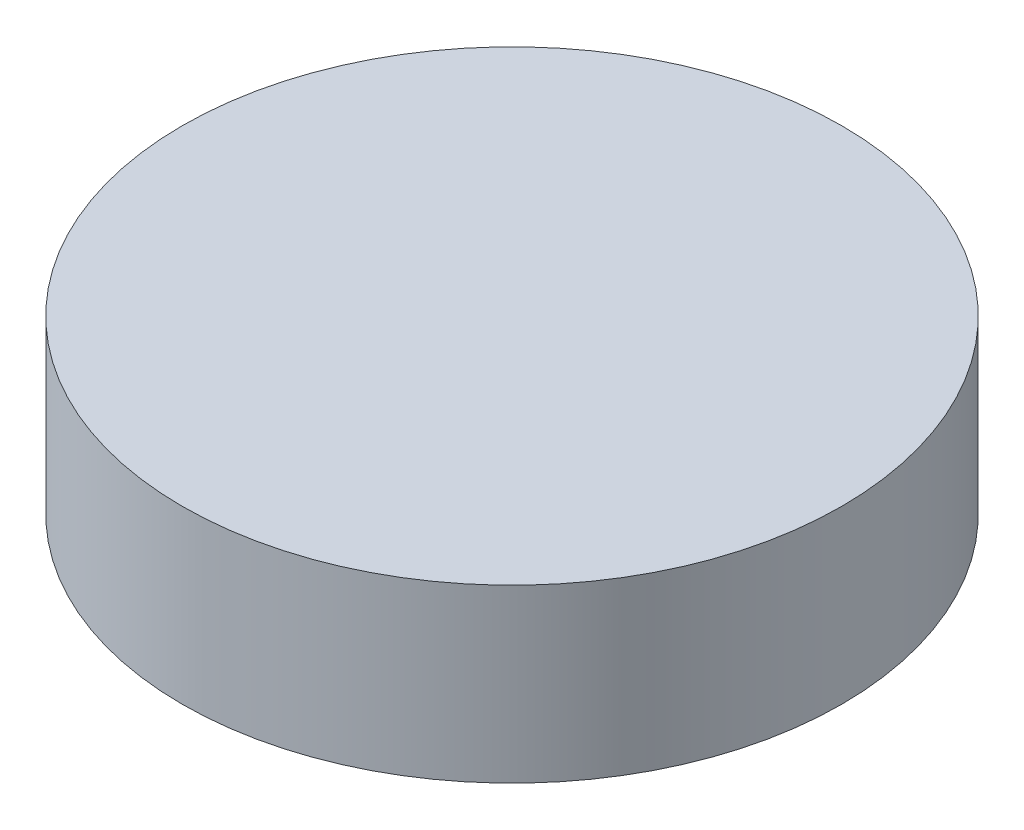
ISO-10303-21;
HEADER;
FILE_DESCRIPTION(('STEP AP214'),'2;1');
FILE_NAME('part.step','',(''),(''),'','','');
FILE_SCHEMA(('AUTOMOTIVE_DESIGN { 1 0 10303 214 1 1 1 1 }'));
ENDSEC;
DATA;
#1=APPLICATION_CONTEXT('core data for automotive mechanical design processes');
#2=APPLICATION_PROTOCOL_DEFINITION('international standard','automotive_design',2000,#1);
#3=PRODUCT_CONTEXT('',#1,'mechanical');
#4=PRODUCT('Part','Part','',(#3));
#5=PRODUCT_RELATED_PRODUCT_CATEGORY('part','',(#4));
#6=PRODUCT_DEFINITION_FORMATION('','',#4);
#7=PRODUCT_DEFINITION_CONTEXT('part definition',#1,'design');
#8=PRODUCT_DEFINITION('design','',#6,#7);
#9=PRODUCT_DEFINITION_SHAPE('','',#8);
#10=(LENGTH_UNIT() NAMED_UNIT(*) SI_UNIT(.MILLI.,.METRE.));
#11=(NAMED_UNIT(*) PLANE_ANGLE_UNIT() SI_UNIT($,.RADIAN.));
#12=(NAMED_UNIT(*) SI_UNIT($,.STERADIAN.) SOLID_ANGLE_UNIT());
#13=UNCERTAINTY_MEASURE_WITH_UNIT(LENGTH_MEASURE(1.E-05),#10,'distance_accuracy_value','');
#14=(GEOMETRIC_REPRESENTATION_CONTEXT(3) GLOBAL_UNCERTAINTY_ASSIGNED_CONTEXT((#13)) GLOBAL_UNIT_ASSIGNED_CONTEXT((#10,
#11,#12)) REPRESENTATION_CONTEXT('',''));
#15=CARTESIAN_POINT('',(0.,0.,0.));
#16=DIRECTION('',(0.,0.,1.));
#17=DIRECTION('',(1.,0.,0.));
#18=AXIS2_PLACEMENT_3D('',#15,#16,#17);
#19=CARTESIAN_POINT('',(0.,5.,0.));
#20=DIRECTION('',(0.,-1.,0.));
#21=DIRECTION('',(0.,0.,-1.));
#22=AXIS2_PLACEMENT_3D('',#19,#20,#21);
#23=CYLINDRICAL_SURFACE('',#22,7.5);
#24=CARTESIAN_POINT('',(0.,5.,0.));
#25=DIRECTION('',(0.,1.,0.));
#26=DIRECTION('',(0.,0.,1.));
#27=AXIS2_PLACEMENT_3D('',#24,#25,#26);
#28=CIRCLE('',#27,7.5);
#29=CARTESIAN_POINT('',(0.,5.,7.5));
#30=VERTEX_POINT('',#29);
#31=EDGE_CURVE('E10',#30,#30,#28,.T.);
#32=ORIENTED_EDGE('',*,*,#31,.F.);
#33=EDGE_LOOP('',(#32));
#34=FACE_BOUND('',#33,.T.);
#35=CARTESIAN_POINT('',(0.,0.,0.));
#36=DIRECTION('',(0.,1.,0.));
#37=DIRECTION('',(0.,0.,1.));
#38=AXIS2_PLACEMENT_3D('',#35,#36,#37);
#39=CIRCLE('',#38,7.5);
#40=CARTESIAN_POINT('',(0.,0.,7.5));
#41=VERTEX_POINT('',#40);
#42=EDGE_CURVE('E39',#41,#41,#39,.T.);
#43=ORIENTED_EDGE('',*,*,#42,.T.);
#44=EDGE_LOOP('',(#43));
#45=FACE_BOUND('',#44,.T.);
#46=ADVANCED_FACE('F36',(#34,#45),#23,.T.);
#47=CARTESIAN_POINT('',(0.,0.,0.));
#48=DIRECTION('',(0.,1.,0.));
#49=DIRECTION('',(0.,0.,1.));
#50=AXIS2_PLACEMENT_3D('',#47,#48,#49);
#51=PLANE('',#50);
#52=ORIENTED_EDGE('',*,*,#42,.F.);
#53=EDGE_LOOP('',(#52));
#54=FACE_BOUND('',#53,.T.);
#55=ADVANCED_FACE('F59',(#54),#51,.F.);
#56=CARTESIAN_POINT('',(0.,18.,0.));
#57=DIRECTION('',(0.,-1.,0.));
#58=DIRECTION('',(0.,0.,-1.));
#59=AXIS2_PLACEMENT_3D('',#56,#57,#58);
#60=CYLINDRICAL_SURFACE('',#59,25.);
#61=CARTESIAN_POINT('',(0.,18.,0.));
#62=DIRECTION('',(0.,1.,0.));
#63=DIRECTION('',(0.,0.,1.));
#64=AXIS2_PLACEMENT_3D('',#61,#62,#63);
#65=CIRCLE('',#64,25.);
#66=CARTESIAN_POINT('',(0.,18.,-25.));
#67=VERTEX_POINT('',#66);
#68=EDGE_CURVE('E46',#67,#67,#65,.T.);
#69=CARTESIAN_POINT('',(0.,5.,0.));
#70=DIRECTION('',(0.,1.,0.));
#71=DIRECTION('',(0.,0.,1.));
#72=AXIS2_PLACEMENT_3D('',#69,#70,#71);
#73=CIRCLE('',#72,25.);
#74=CARTESIAN_POINT('',(0.,5.,-25.));
#75=VERTEX_POINT('',#74);
#76=EDGE_CURVE('E48',#75,#75,#73,.T.);
#77=CARTESIAN_POINT('',(0.,18.,-25.));
#78=CARTESIAN_POINT('',(0.,17.8645833333333,-25.));
#79=CARTESIAN_POINT('',(0.,17.7291666666667,-25.));
#80=CARTESIAN_POINT('',(0.,17.4583333333333,-25.));
#81=CARTESIAN_POINT('',(0.,17.3229166666667,-25.));
#82=CARTESIAN_POINT('',(0.,17.0520833333333,-25.));
#83=CARTESIAN_POINT('',(0.,16.9166666666667,-25.));
#84=CARTESIAN_POINT('',(0.,16.6458333333333,-25.));
#85=CARTESIAN_POINT('',(0.,16.5104166666667,-25.));
#86=CARTESIAN_POINT('',(0.,16.2395833333333,-25.));
#87=CARTESIAN_POINT('',(0.,16.1041666666667,-25.));
#88=CARTESIAN_POINT('',(0.,15.8333333333333,-25.));
#89=CARTESIAN_POINT('',(0.,15.6979166666667,-25.));
#90=CARTESIAN_POINT('',(0.,15.4270833333333,-25.));
#91=CARTESIAN_POINT('',(0.,15.2916666666667,-25.));
#92=CARTESIAN_POINT('',(0.,15.0208333333333,-25.));
#93=CARTESIAN_POINT('',(0.,14.8854166666667,-25.));
#94=CARTESIAN_POINT('',(0.,14.6145833333333,-25.));
#95=CARTESIAN_POINT('',(0.,14.4791666666667,-25.));
#96=CARTESIAN_POINT('',(0.,14.2083333333333,-25.));
#97=CARTESIAN_POINT('',(0.,14.0729166666667,-25.));
#98=CARTESIAN_POINT('',(0.,13.8020833333333,-25.));
#99=CARTESIAN_POINT('',(0.,13.6666666666667,-25.));
#100=CARTESIAN_POINT('',(0.,13.3958333333333,-25.));
#101=CARTESIAN_POINT('',(0.,13.2604166666667,-25.));
#102=CARTESIAN_POINT('',(0.,12.9895833333333,-25.));
#103=CARTESIAN_POINT('',(0.,12.8541666666667,-25.));
#104=CARTESIAN_POINT('',(0.,12.5833333333333,-25.));
#105=CARTESIAN_POINT('',(0.,12.4479166666667,-25.));
#106=CARTESIAN_POINT('',(0.,12.1770833333333,-25.));
#107=CARTESIAN_POINT('',(0.,12.0416666666667,-25.));
#108=CARTESIAN_POINT('',(0.,11.7708333333333,-25.));
#109=CARTESIAN_POINT('',(0.,11.6354166666667,-25.));
#110=CARTESIAN_POINT('',(0.,11.3645833333333,-25.));
#111=CARTESIAN_POINT('',(0.,11.2291666666667,-25.));
#112=CARTESIAN_POINT('',(0.,10.9583333333333,-25.));
#113=CARTESIAN_POINT('',(0.,10.8229166666667,-25.));
#114=CARTESIAN_POINT('',(0.,10.5520833333333,-25.));
#115=CARTESIAN_POINT('',(0.,10.4166666666667,-25.));
#116=CARTESIAN_POINT('',(0.,10.1458333333333,-25.));
#117=CARTESIAN_POINT('',(0.,10.0104166666667,-25.));
#118=CARTESIAN_POINT('',(0.,9.73958333333333,-25.));
#119=CARTESIAN_POINT('',(0.,9.60416666666667,-25.));
#120=CARTESIAN_POINT('',(0.,9.33333333333333,-25.));
#121=CARTESIAN_POINT('',(0.,9.19791666666667,-25.));
#122=CARTESIAN_POINT('',(0.,8.92708333333333,-25.));
#123=CARTESIAN_POINT('',(0.,8.79166666666667,-25.));
#124=CARTESIAN_POINT('',(0.,8.52083333333333,-25.));
#125=CARTESIAN_POINT('',(0.,8.38541666666667,-25.));
#126=CARTESIAN_POINT('',(0.,8.11458333333333,-25.));
#127=CARTESIAN_POINT('',(0.,7.97916666666667,-25.));
#128=CARTESIAN_POINT('',(0.,7.70833333333333,-25.));
#129=CARTESIAN_POINT('',(0.,7.57291666666667,-25.));
#130=CARTESIAN_POINT('',(0.,7.30208333333333,-25.));
#131=CARTESIAN_POINT('',(0.,7.16666666666667,-25.));
#132=CARTESIAN_POINT('',(0.,6.89583333333333,-25.));
#133=CARTESIAN_POINT('',(0.,6.76041666666667,-25.));
#134=CARTESIAN_POINT('',(0.,6.48958333333333,-25.));
#135=CARTESIAN_POINT('',(0.,6.35416666666667,-25.));
#136=CARTESIAN_POINT('',(0.,6.08333333333333,-25.));
#137=CARTESIAN_POINT('',(0.,5.94791666666667,-25.));
#138=CARTESIAN_POINT('',(0.,5.67708333333333,-25.));
#139=CARTESIAN_POINT('',(0.,5.54166666666667,-25.));
#140=CARTESIAN_POINT('',(0.,5.27083333333333,-25.));
#141=CARTESIAN_POINT('',(0.,5.13541666666667,-25.));
#142=CARTESIAN_POINT('',(0.,5.,-25.));
#143=B_SPLINE_CURVE_WITH_KNOTS('',3,(#77,#78,#79,#80,#81,#82,#83,#84,#85,#86,#87,#88,#89,#90,
#91,#92,#93,#94,#95,#96,#97,#98,#99,#100,#101,#102,#103,#104,#105,#106,#107,#108,#109,#110,#111,
#112,#113,#114,#115,#116,#117,#118,#119,#120,#121,#122,#123,#124,#125,#126,#127,#128,#129,#130,
#131,#132,#133,#134,#135,#136,#137,#138,#139,#140,#141,#142),.UNSPECIFIED.,.F.,.F.,(4,2,2,2,2,2,
2,2,2,2,2,2,2,2,2,2,2,2,2,2,2,2,2,2,2,2,2,2,2,2,2,2,4),(0.,0.406249999999997,0.812499999999997,
1.21875,1.625,2.03125,2.4375,2.84375,3.25,3.65625,4.0625,4.46875,4.875,5.28125,5.6875,6.09375,
6.5,6.90625,7.3125,7.71875,8.125,8.53124999999999,8.9375,9.34375,9.75,10.15625,10.5625,10.96875,
11.375,11.78125,12.1875,12.59375,13.),.UNSPECIFIED.);
#144=EDGE_CURVE('BSEAM56',#67,#75,#143,.T.);
#145=ORIENTED_EDGE('',*,*,#68,.F.);
#146=ORIENTED_EDGE('',*,*,#76,.T.);
#147=ORIENTED_EDGE('',*,*,#144,.T.);
#148=ORIENTED_EDGE('',*,*,#144,.F.);
#149=EDGE_LOOP('',(#145,#147,#146,#148));
#150=FACE_BOUND('',#149,.T.);
#151=ADVANCED_FACE('F56',(#150),#60,.T.);
#152=CARTESIAN_POINT('',(0.,18.,0.));
#153=DIRECTION('',(0.,1.,0.));
#154=DIRECTION('',(0.,0.,1.));
#155=AXIS2_PLACEMENT_3D('',#152,#153,#154);
#156=PLANE('',#155);
#157=ORIENTED_EDGE('',*,*,#68,.T.);
#158=EDGE_LOOP('',(#157));
#159=FACE_BOUND('',#158,.T.);
#160=ADVANCED_FACE('F54',(#159),#156,.T.);
#161=CARTESIAN_POINT('',(0.,5.,0.));
#162=DIRECTION('',(0.,1.,0.));
#163=DIRECTION('',(0.,0.,1.));
#164=AXIS2_PLACEMENT_3D('',#161,#162,#163);
#165=PLANE('',#164);
#166=ORIENTED_EDGE('',*,*,#31,.T.);
#167=EDGE_LOOP('',(#166));
#168=FACE_BOUND('',#167,.T.);
#169=ORIENTED_EDGE('',*,*,#76,.F.);
#170=EDGE_LOOP('',(#169));
#171=FACE_BOUND('',#170,.T.);
#172=ADVANCED_FACE('F63',(#168,#171),#165,.F.);
#173=CLOSED_SHELL('',(#46,#55,#151,#160,#172));
#174=MANIFOLD_SOLID_BREP('B2',#173);
#175=ADVANCED_BREP_SHAPE_REPRESENTATION('',(#18,#174),#14);
#176=SHAPE_DEFINITION_REPRESENTATION(#9,#175);
ENDSEC;
END-ISO-10303-21;
